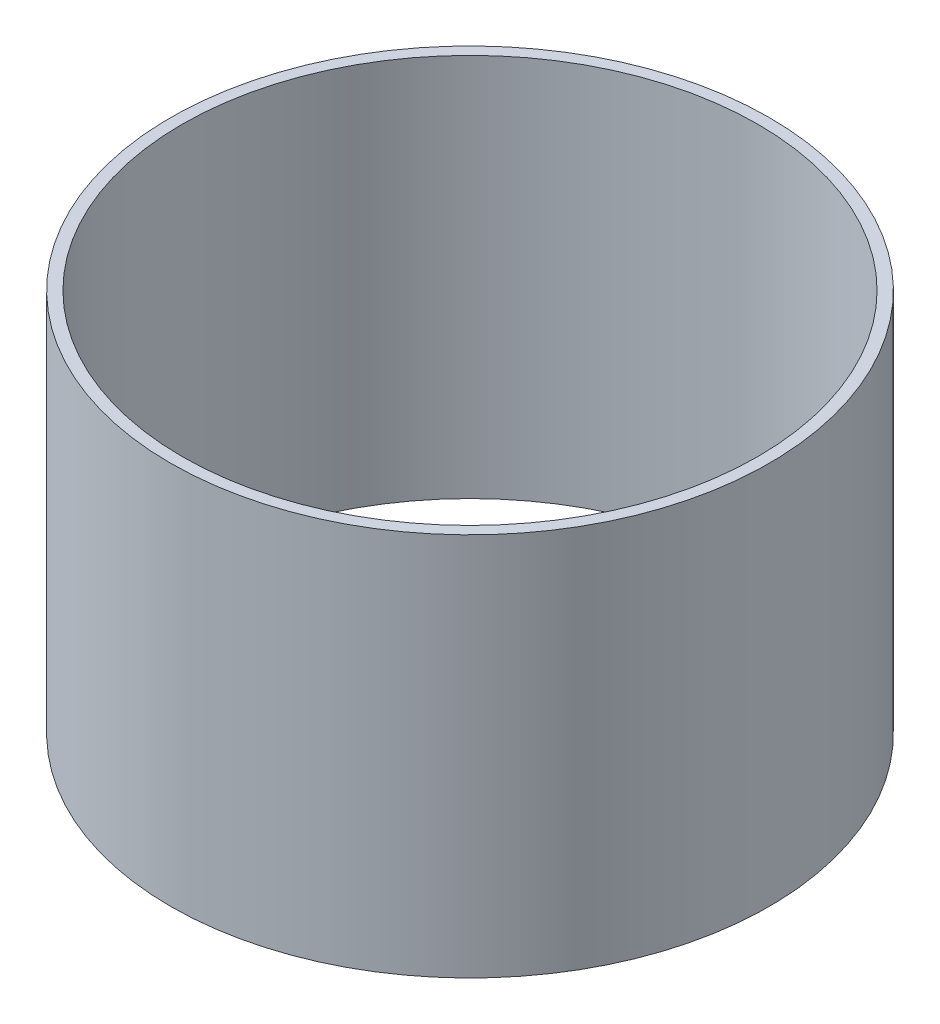
ISO-10303-21;
HEADER;
FILE_DESCRIPTION(('STEP AP214'),'2;1');
FILE_NAME('part.step','',(''),(''),'','','');
FILE_SCHEMA(('AUTOMOTIVE_DESIGN { 1 0 10303 214 1 1 1 1 }'));
ENDSEC;
DATA;
#1=APPLICATION_CONTEXT('core data for automotive mechanical design processes');
#2=APPLICATION_PROTOCOL_DEFINITION('international standard','automotive_design',2000,#1);
#3=PRODUCT_CONTEXT('',#1,'mechanical');
#4=PRODUCT('Part','Part','',(#3));
#5=PRODUCT_RELATED_PRODUCT_CATEGORY('part','',(#4));
#6=PRODUCT_DEFINITION_FORMATION('','',#4);
#7=PRODUCT_DEFINITION_CONTEXT('part definition',#1,'design');
#8=PRODUCT_DEFINITION('design','',#6,#7);
#9=PRODUCT_DEFINITION_SHAPE('','',#8);
#10=(LENGTH_UNIT() NAMED_UNIT(*) SI_UNIT(.MILLI.,.METRE.));
#11=(NAMED_UNIT(*) PLANE_ANGLE_UNIT() SI_UNIT($,.RADIAN.));
#12=(NAMED_UNIT(*) SI_UNIT($,.STERADIAN.) SOLID_ANGLE_UNIT());
#13=UNCERTAINTY_MEASURE_WITH_UNIT(LENGTH_MEASURE(1.E-05),#10,'distance_accuracy_value','');
#14=(GEOMETRIC_REPRESENTATION_CONTEXT(3) GLOBAL_UNCERTAINTY_ASSIGNED_CONTEXT((#13)) GLOBAL_UNIT_ASSIGNED_CONTEXT((#10,
#11,#12)) REPRESENTATION_CONTEXT('',''));
#15=CARTESIAN_POINT('',(0.,0.,0.));
#16=DIRECTION('',(0.,0.,1.));
#17=DIRECTION('',(1.,0.,0.));
#18=AXIS2_PLACEMENT_3D('',#15,#16,#17);
#19=CARTESIAN_POINT('',(0.,50.8,0.));
#20=DIRECTION('',(0.,1.,0.));
#21=DIRECTION('',(0.,0.,1.));
#22=AXIS2_PLACEMENT_3D('',#19,#20,#21);
#23=PLANE('',#22);
#24=CARTESIAN_POINT('',(0.,50.8,0.));
#25=DIRECTION('',(0.,1.,0.));
#26=DIRECTION('',(0.,0.,1.));
#27=AXIS2_PLACEMENT_3D('',#24,#25,#26);
#28=CIRCLE('',#27,39.624);
#29=CARTESIAN_POINT('',(0.,50.8,39.624));
#30=VERTEX_POINT('',#29);
#31=EDGE_CURVE('E10',#30,#30,#28,.T.);
#32=ORIENTED_EDGE('',*,*,#31,.T.);
#33=EDGE_LOOP('',(#32));
#34=FACE_BOUND('',#33,.T.);
#35=CARTESIAN_POINT('',(0.,50.8,0.));
#36=DIRECTION('',(0.,1.,0.));
#37=DIRECTION('',(0.,0.,1.));
#38=AXIS2_PLACEMENT_3D('',#35,#36,#37);
#39=CIRCLE('',#38,38.1);
#40=CARTESIAN_POINT('',(0.,50.8,38.1));
#41=VERTEX_POINT('',#40);
#42=EDGE_CURVE('E56',#41,#41,#39,.T.);
#43=ORIENTED_EDGE('',*,*,#42,.F.);
#44=EDGE_LOOP('',(#43));
#45=FACE_BOUND('',#44,.T.);
#46=ADVANCED_FACE('F43',(#34,#45),#23,.T.);
#47=CARTESIAN_POINT('',(0.,0.,0.));
#48=DIRECTION('',(0.,1.,0.));
#49=DIRECTION('',(0.,0.,1.));
#50=AXIS2_PLACEMENT_3D('',#47,#48,#49);
#51=PLANE('',#50);
#52=CARTESIAN_POINT('',(0.,0.,0.));
#53=DIRECTION('',(0.,1.,0.));
#54=DIRECTION('',(0.,0.,1.));
#55=AXIS2_PLACEMENT_3D('',#52,#53,#54);
#56=CIRCLE('',#55,39.624);
#57=CARTESIAN_POINT('',(0.,0.,39.624));
#58=VERTEX_POINT('',#57);
#59=EDGE_CURVE('E47',#58,#58,#56,.T.);
#60=ORIENTED_EDGE('',*,*,#59,.F.);
#61=EDGE_LOOP('',(#60));
#62=FACE_BOUND('',#61,.T.);
#63=CARTESIAN_POINT('',(0.,0.,0.));
#64=DIRECTION('',(0.,1.,0.));
#65=DIRECTION('',(0.,0.,1.));
#66=AXIS2_PLACEMENT_3D('',#63,#64,#65);
#67=CIRCLE('',#66,38.1);
#68=CARTESIAN_POINT('',(0.,0.,38.1));
#69=VERTEX_POINT('',#68);
#70=EDGE_CURVE('E58',#69,#69,#67,.T.);
#71=ORIENTED_EDGE('',*,*,#70,.T.);
#72=EDGE_LOOP('',(#71));
#73=FACE_BOUND('',#72,.T.);
#74=ADVANCED_FACE('F70',(#62,#73),#51,.F.);
#75=CARTESIAN_POINT('',(0.,50.8,0.));
#76=DIRECTION('',(0.,-1.,0.));
#77=DIRECTION('',(0.,0.,-1.));
#78=AXIS2_PLACEMENT_3D('',#75,#76,#77);
#79=CYLINDRICAL_SURFACE('',#78,39.624);
#80=ORIENTED_EDGE('',*,*,#31,.F.);
#81=EDGE_LOOP('',(#80));
#82=FACE_BOUND('',#81,.T.);
#83=ORIENTED_EDGE('',*,*,#59,.T.);
#84=EDGE_LOOP('',(#83));
#85=FACE_BOUND('',#84,.T.);
#86=ADVANCED_FACE('F45',(#82,#85),#79,.T.);
#87=CARTESIAN_POINT('',(0.,50.8,0.));
#88=DIRECTION('',(0.,-1.,0.));
#89=DIRECTION('',(0.,0.,-1.));
#90=AXIS2_PLACEMENT_3D('',#87,#88,#89);
#91=CYLINDRICAL_SURFACE('',#90,38.1);
#92=ORIENTED_EDGE('',*,*,#42,.T.);
#93=EDGE_LOOP('',(#92));
#94=FACE_BOUND('',#93,.T.);
#95=ORIENTED_EDGE('',*,*,#70,.F.);
#96=EDGE_LOOP('',(#95));
#97=FACE_BOUND('',#96,.T.);
#98=ADVANCED_FACE('F66',(#94,#97),#91,.F.);
#99=CLOSED_SHELL('',(#46,#74,#86,#98));
#100=MANIFOLD_SOLID_BREP('B2',#99);
#101=ADVANCED_BREP_SHAPE_REPRESENTATION('',(#18,#100),#14);
#102=SHAPE_DEFINITION_REPRESENTATION(#9,#101);
ENDSEC;
END-ISO-10303-21;
